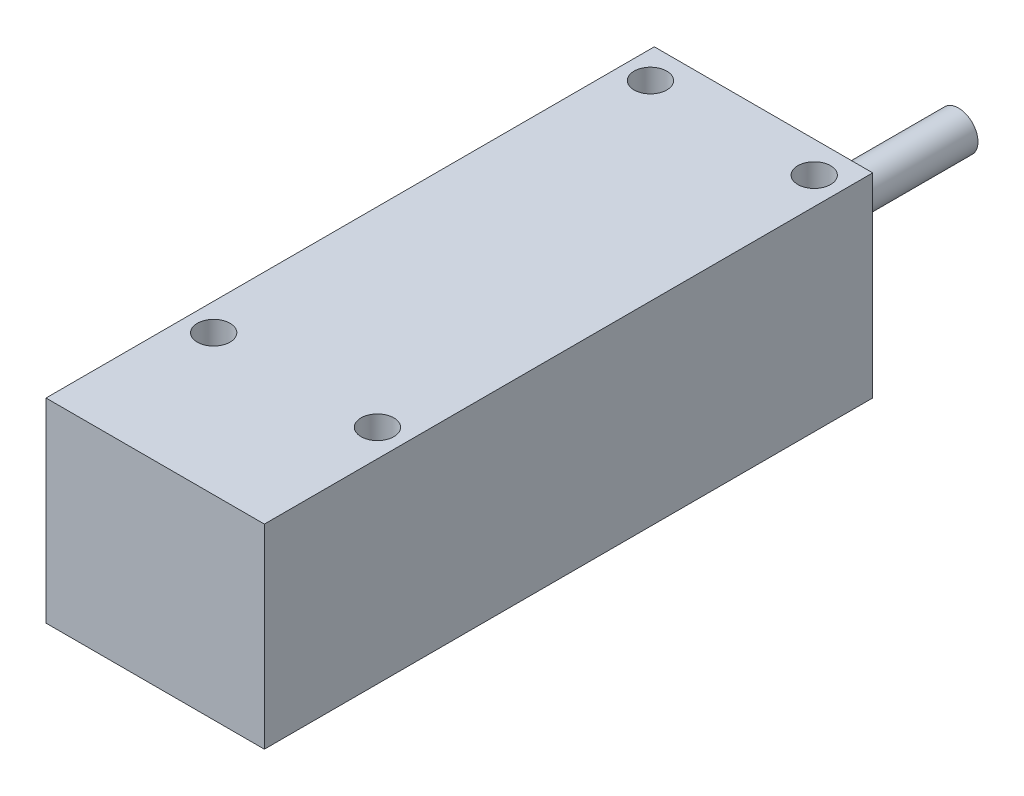
ISO-10303-21;
HEADER;
FILE_DESCRIPTION(('STEP AP214'),'2;1');
FILE_NAME('part.step','',(''),(''),'','','');
FILE_SCHEMA(('AUTOMOTIVE_DESIGN { 1 0 10303 214 1 1 1 1 }'));
ENDSEC;
DATA;
#1=APPLICATION_CONTEXT('core data for automotive mechanical design processes');
#2=APPLICATION_PROTOCOL_DEFINITION('international standard','automotive_design',2000,#1);
#3=PRODUCT_CONTEXT('',#1,'mechanical');
#4=PRODUCT('Part','Part','',(#3));
#5=PRODUCT_RELATED_PRODUCT_CATEGORY('part','',(#4));
#6=PRODUCT_DEFINITION_FORMATION('','',#4);
#7=PRODUCT_DEFINITION_CONTEXT('part definition',#1,'design');
#8=PRODUCT_DEFINITION('design','',#6,#7);
#9=PRODUCT_DEFINITION_SHAPE('','',#8);
#10=(LENGTH_UNIT() NAMED_UNIT(*) SI_UNIT(.MILLI.,.METRE.));
#11=(NAMED_UNIT(*) PLANE_ANGLE_UNIT() SI_UNIT($,.RADIAN.));
#12=(NAMED_UNIT(*) SI_UNIT($,.STERADIAN.) SOLID_ANGLE_UNIT());
#13=UNCERTAINTY_MEASURE_WITH_UNIT(LENGTH_MEASURE(1.E-05),#10,'distance_accuracy_value','');
#14=(GEOMETRIC_REPRESENTATION_CONTEXT(3) GLOBAL_UNCERTAINTY_ASSIGNED_CONTEXT((#13)) GLOBAL_UNIT_ASSIGNED_CONTEXT((#10,
#11,#12)) REPRESENTATION_CONTEXT('',''));
#15=CARTESIAN_POINT('',(0.,0.,0.));
#16=DIRECTION('',(0.,0.,1.));
#17=DIRECTION('',(1.,0.,0.));
#18=AXIS2_PLACEMENT_3D('',#15,#16,#17);
#19=CARTESIAN_POINT('',(-14.,-12.5,39.));
#20=DIRECTION('',(1.,0.,0.));
#21=DIRECTION('',(0.,0.,-1.));
#22=AXIS2_PLACEMENT_3D('',#19,#20,#21);
#23=PLANE('',#22);
#24=DIRECTION('',(0.,-1.,0.));
#25=VECTOR('',#24,1.);
#26=CARTESIAN_POINT('',(-14.,-12.5,-39.));
#27=LINE('',#26,#25);
#28=CARTESIAN_POINT('',(-14.,12.5,-39.));
#29=VERTEX_POINT('',#28);
#30=CARTESIAN_POINT('',(-14.,-12.5,-39.));
#31=VERTEX_POINT('',#30);
#32=EDGE_CURVE('E98',#29,#31,#27,.T.);
#33=ORIENTED_EDGE('',*,*,#32,.T.);
#34=DIRECTION('',(0.,0.,-1.));
#35=VECTOR('',#34,1.);
#36=CARTESIAN_POINT('',(-14.,-12.5,39.));
#37=LINE('',#36,#35);
#38=CARTESIAN_POINT('',(-14.,-12.5,39.));
#39=VERTEX_POINT('',#38);
#40=EDGE_CURVE('E40',#39,#31,#37,.T.);
#41=ORIENTED_EDGE('',*,*,#40,.F.);
#42=DIRECTION('',(0.,-1.,0.));
#43=VECTOR('',#42,1.);
#44=CARTESIAN_POINT('',(-14.,-12.5,39.));
#45=LINE('',#44,#43);
#46=CARTESIAN_POINT('',(-14.,12.5,39.));
#47=VERTEX_POINT('',#46);
#48=EDGE_CURVE('E84',#47,#39,#45,.T.);
#49=ORIENTED_EDGE('',*,*,#48,.F.);
#50=DIRECTION('',(0.,0.,-1.));
#51=VECTOR('',#50,1.);
#52=CARTESIAN_POINT('',(-14.,12.5,39.));
#53=LINE('',#52,#51);
#54=EDGE_CURVE('E94',#47,#29,#53,.T.);
#55=ORIENTED_EDGE('',*,*,#54,.T.);
#56=EDGE_LOOP('',(#33,#41,#49,#55));
#57=FACE_BOUND('',#56,.T.);
#58=ADVANCED_FACE('F32',(#57),#23,.F.);
#59=CARTESIAN_POINT('',(14.,-12.5,39.));
#60=DIRECTION('',(0.,1.,0.));
#61=DIRECTION('',(-1.,0.,0.));
#62=AXIS2_PLACEMENT_3D('',#59,#60,#61);
#63=PLANE('',#62);
#64=CARTESIAN_POINT('',(-10.5,-12.5,-35.));
#65=DIRECTION('',(0.,-1.,0.));
#66=DIRECTION('',(1.,0.,0.));
#67=AXIS2_PLACEMENT_3D('',#64,#65,#66);
#68=CIRCLE('',#67,2.1);
#69=CARTESIAN_POINT('',(-8.40000000000001,-12.5,-35.));
#70=VERTEX_POINT('',#69);
#71=EDGE_CURVE('E157',#70,#70,#68,.T.);
#72=ORIENTED_EDGE('',*,*,#71,.F.);
#73=EDGE_LOOP('',(#72));
#74=FACE_BOUND('',#73,.T.);
#75=CARTESIAN_POINT('',(-10.5,-12.5,21.));
#76=DIRECTION('',(0.,-1.,0.));
#77=DIRECTION('',(1.,0.,0.));
#78=AXIS2_PLACEMENT_3D('',#75,#76,#77);
#79=CIRCLE('',#78,2.1);
#80=CARTESIAN_POINT('',(-8.4,-12.5,21.));
#81=VERTEX_POINT('',#80);
#82=EDGE_CURVE('E168',#81,#81,#79,.T.);
#83=ORIENTED_EDGE('',*,*,#82,.F.);
#84=EDGE_LOOP('',(#83));
#85=FACE_BOUND('',#84,.T.);
#86=CARTESIAN_POINT('',(10.5,-12.5,-35.));
#87=DIRECTION('',(0.,1.,0.));
#88=DIRECTION('',(-1.,0.,0.));
#89=AXIS2_PLACEMENT_3D('',#86,#87,#88);
#90=CIRCLE('',#89,2.1);
#91=CARTESIAN_POINT('',(8.40000000000001,-12.5,-35.));
#92=VERTEX_POINT('',#91);
#93=EDGE_CURVE('E101',#92,#92,#90,.T.);
#94=ORIENTED_EDGE('',*,*,#93,.T.);
#95=EDGE_LOOP('',(#94));
#96=FACE_BOUND('',#95,.T.);
#97=CARTESIAN_POINT('',(10.5,-12.5,21.));
#98=DIRECTION('',(0.,1.,0.));
#99=DIRECTION('',(-1.,0.,0.));
#100=AXIS2_PLACEMENT_3D('',#97,#98,#99);
#101=CIRCLE('',#100,2.1);
#102=CARTESIAN_POINT('',(8.4,-12.5,21.));
#103=VERTEX_POINT('',#102);
#104=EDGE_CURVE('E156',#103,#103,#101,.T.);
#105=ORIENTED_EDGE('',*,*,#104,.T.);
#106=EDGE_LOOP('',(#105));
#107=FACE_BOUND('',#106,.T.);
#108=DIRECTION('',(1.,0.,0.));
#109=VECTOR('',#108,1.);
#110=CARTESIAN_POINT('',(14.,-12.5,-39.));
#111=LINE('',#110,#109);
#112=CARTESIAN_POINT('',(14.,-12.5,-39.));
#113=VERTEX_POINT('',#112);
#114=EDGE_CURVE('E89',#31,#113,#111,.T.);
#115=ORIENTED_EDGE('',*,*,#114,.T.);
#116=DIRECTION('',(0.,0.,-1.));
#117=VECTOR('',#116,1.);
#118=CARTESIAN_POINT('',(14.,-12.5,39.));
#119=LINE('',#118,#117);
#120=CARTESIAN_POINT('',(14.,-12.5,39.));
#121=VERTEX_POINT('',#120);
#122=EDGE_CURVE('E87',#121,#113,#119,.T.);
#123=ORIENTED_EDGE('',*,*,#122,.F.);
#124=DIRECTION('',(1.,0.,0.));
#125=VECTOR('',#124,1.);
#126=CARTESIAN_POINT('',(14.,-12.5,39.));
#127=LINE('',#126,#125);
#128=EDGE_CURVE('E79',#39,#121,#127,.T.);
#129=ORIENTED_EDGE('',*,*,#128,.F.);
#130=ORIENTED_EDGE('',*,*,#40,.T.);
#131=EDGE_LOOP('',(#115,#123,#129,#130));
#132=FACE_BOUND('',#131,.T.);
#133=ADVANCED_FACE('F88',(#74,#85,#96,#107,#132),#63,.F.);
#134=CARTESIAN_POINT('',(14.,-12.5,39.));
#135=DIRECTION('',(-1.,0.,0.));
#136=DIRECTION('',(0.,0.,1.));
#137=AXIS2_PLACEMENT_3D('',#134,#135,#136);
#138=PLANE('',#137);
#139=DIRECTION('',(0.,1.,0.));
#140=VECTOR('',#139,1.);
#141=CARTESIAN_POINT('',(14.,-12.5,-39.));
#142=LINE('',#141,#140);
#143=CARTESIAN_POINT('',(14.,12.5,-39.));
#144=VERTEX_POINT('',#143);
#145=EDGE_CURVE('E65',#113,#144,#142,.T.);
#146=ORIENTED_EDGE('',*,*,#145,.T.);
#147=DIRECTION('',(0.,0.,-1.));
#148=VECTOR('',#147,1.);
#149=CARTESIAN_POINT('',(14.,12.5,39.));
#150=LINE('',#149,#148);
#151=CARTESIAN_POINT('',(14.,12.5,39.));
#152=VERTEX_POINT('',#151);
#153=EDGE_CURVE('E90',#152,#144,#150,.T.);
#154=ORIENTED_EDGE('',*,*,#153,.F.);
#155=DIRECTION('',(0.,1.,0.));
#156=VECTOR('',#155,1.);
#157=CARTESIAN_POINT('',(14.,-12.5,39.));
#158=LINE('',#157,#156);
#159=EDGE_CURVE('E82',#121,#152,#158,.T.);
#160=ORIENTED_EDGE('',*,*,#159,.F.);
#161=ORIENTED_EDGE('',*,*,#122,.T.);
#162=EDGE_LOOP('',(#146,#154,#160,#161));
#163=FACE_BOUND('',#162,.T.);
#164=ADVANCED_FACE('F92',(#163),#138,.F.);
#165=CARTESIAN_POINT('',(14.,12.5,39.));
#166=DIRECTION('',(0.,-1.,0.));
#167=DIRECTION('',(1.,0.,0.));
#168=AXIS2_PLACEMENT_3D('',#165,#166,#167);
#169=PLANE('',#168);
#170=CARTESIAN_POINT('',(-10.5,12.5,-35.));
#171=DIRECTION('',(0.,-1.,0.));
#172=DIRECTION('',(1.,0.,0.));
#173=AXIS2_PLACEMENT_3D('',#170,#171,#172);
#174=CIRCLE('',#173,2.1);
#175=CARTESIAN_POINT('',(-8.4,12.5,-35.));
#176=VERTEX_POINT('',#175);
#177=EDGE_CURVE('E143',#176,#176,#174,.T.);
#178=ORIENTED_EDGE('',*,*,#177,.T.);
#179=EDGE_LOOP('',(#178));
#180=FACE_BOUND('',#179,.T.);
#181=CARTESIAN_POINT('',(-10.5,12.5,21.));
#182=DIRECTION('',(0.,-1.,0.));
#183=DIRECTION('',(1.,0.,0.));
#184=AXIS2_PLACEMENT_3D('',#181,#182,#183);
#185=CIRCLE('',#184,2.1);
#186=CARTESIAN_POINT('',(-8.4,12.5,21.));
#187=VERTEX_POINT('',#186);
#188=EDGE_CURVE('E147',#187,#187,#185,.T.);
#189=ORIENTED_EDGE('',*,*,#188,.T.);
#190=EDGE_LOOP('',(#189));
#191=FACE_BOUND('',#190,.T.);
#192=CARTESIAN_POINT('',(10.5,12.5,-35.));
#193=DIRECTION('',(0.,1.,0.));
#194=DIRECTION('',(-1.,0.,0.));
#195=AXIS2_PLACEMENT_3D('',#192,#193,#194);
#196=CIRCLE('',#195,2.1);
#197=CARTESIAN_POINT('',(8.4,12.5,-35.));
#198=VERTEX_POINT('',#197);
#199=EDGE_CURVE('E151',#198,#198,#196,.T.);
#200=ORIENTED_EDGE('',*,*,#199,.F.);
#201=EDGE_LOOP('',(#200));
#202=FACE_BOUND('',#201,.T.);
#203=CARTESIAN_POINT('',(10.5,12.5,21.));
#204=DIRECTION('',(0.,1.,0.));
#205=DIRECTION('',(-1.,0.,0.));
#206=AXIS2_PLACEMENT_3D('',#203,#204,#205);
#207=CIRCLE('',#206,2.1);
#208=CARTESIAN_POINT('',(8.4,12.5,21.));
#209=VERTEX_POINT('',#208);
#210=EDGE_CURVE('E154',#209,#209,#207,.T.);
#211=ORIENTED_EDGE('',*,*,#210,.F.);
#212=EDGE_LOOP('',(#211));
#213=FACE_BOUND('',#212,.T.);
#214=DIRECTION('',(-1.,0.,0.));
#215=VECTOR('',#214,1.);
#216=CARTESIAN_POINT('',(14.,12.5,-39.));
#217=LINE('',#216,#215);
#218=EDGE_CURVE('E71',#144,#29,#217,.T.);
#219=ORIENTED_EDGE('',*,*,#218,.T.);
#220=ORIENTED_EDGE('',*,*,#54,.F.);
#221=DIRECTION('',(-1.,0.,0.));
#222=VECTOR('',#221,1.);
#223=CARTESIAN_POINT('',(14.,12.5,39.));
#224=LINE('',#223,#222);
#225=EDGE_CURVE('E48',#152,#47,#224,.T.);
#226=ORIENTED_EDGE('',*,*,#225,.F.);
#227=ORIENTED_EDGE('',*,*,#153,.T.);
#228=EDGE_LOOP('',(#219,#220,#226,#227));
#229=FACE_BOUND('',#228,.T.);
#230=ADVANCED_FACE('F121',(#180,#191,#202,#213,#229),#169,.F.);
#231=CARTESIAN_POINT('',(0.,0.,39.));
#232=DIRECTION('',(0.,0.,1.));
#233=DIRECTION('',(1.,0.,0.));
#234=AXIS2_PLACEMENT_3D('',#231,#232,#233);
#235=PLANE('',#234);
#236=ORIENTED_EDGE('',*,*,#48,.T.);
#237=ORIENTED_EDGE('',*,*,#128,.T.);
#238=ORIENTED_EDGE('',*,*,#159,.T.);
#239=ORIENTED_EDGE('',*,*,#225,.T.);
#240=EDGE_LOOP('',(#236,#237,#238,#239));
#241=FACE_BOUND('',#240,.T.);
#242=ADVANCED_FACE('F80',(#241),#235,.T.);
#243=CARTESIAN_POINT('',(0.,0.,-39.));
#244=DIRECTION('',(0.,0.,1.));
#245=DIRECTION('',(1.,0.,0.));
#246=AXIS2_PLACEMENT_3D('',#243,#244,#245);
#247=PLANE('',#246);
#248=CARTESIAN_POINT('',(0.,-2.3,-39.));
#249=DIRECTION('',(0.,0.,1.));
#250=DIRECTION('',(1.,0.,0.));
#251=AXIS2_PLACEMENT_3D('',#248,#249,#250);
#252=CIRCLE('',#251,2.5);
#253=CARTESIAN_POINT('',(2.5,-2.3,-39.));
#254=VERTEX_POINT('',#253);
#255=EDGE_CURVE('E11',#254,#254,#252,.F.);
#256=ORIENTED_EDGE('',*,*,#255,.F.);
#257=EDGE_LOOP('',(#256));
#258=FACE_BOUND('',#257,.T.);
#259=ORIENTED_EDGE('',*,*,#32,.F.);
#260=ORIENTED_EDGE('',*,*,#218,.F.);
#261=ORIENTED_EDGE('',*,*,#145,.F.);
#262=ORIENTED_EDGE('',*,*,#114,.F.);
#263=EDGE_LOOP('',(#259,#260,#261,#262));
#264=FACE_BOUND('',#263,.T.);
#265=ADVANCED_FACE('F109',(#258,#264),#247,.F.);
#266=CARTESIAN_POINT('',(10.5,-12.5,21.));
#267=DIRECTION('',(0.,1.,0.));
#268=DIRECTION('',(-1.,0.,0.));
#269=AXIS2_PLACEMENT_3D('',#266,#267,#268);
#270=CYLINDRICAL_SURFACE('',#269,2.1);
#271=ORIENTED_EDGE('',*,*,#104,.F.);
#272=EDGE_LOOP('',(#271));
#273=FACE_BOUND('',#272,.T.);
#274=ORIENTED_EDGE('',*,*,#210,.T.);
#275=EDGE_LOOP('',(#274));
#276=FACE_BOUND('',#275,.T.);
#277=ADVANCED_FACE('F111',(#273,#276),#270,.F.);
#278=CARTESIAN_POINT('',(10.5,-12.5,-35.));
#279=DIRECTION('',(0.,1.,0.));
#280=DIRECTION('',(-1.,0.,0.));
#281=AXIS2_PLACEMENT_3D('',#278,#279,#280);
#282=CYLINDRICAL_SURFACE('',#281,2.1);
#283=ORIENTED_EDGE('',*,*,#93,.F.);
#284=EDGE_LOOP('',(#283));
#285=FACE_BOUND('',#284,.T.);
#286=ORIENTED_EDGE('',*,*,#199,.T.);
#287=EDGE_LOOP('',(#286));
#288=FACE_BOUND('',#287,.T.);
#289=ADVANCED_FACE('F118',(#285,#288),#282,.F.);
#290=CARTESIAN_POINT('',(-10.5,-12.5,21.));
#291=DIRECTION('',(0.,1.,0.));
#292=DIRECTION('',(-1.,0.,0.));
#293=AXIS2_PLACEMENT_3D('',#290,#291,#292);
#294=CYLINDRICAL_SURFACE('',#293,2.1);
#295=ORIENTED_EDGE('',*,*,#82,.T.);
#296=EDGE_LOOP('',(#295));
#297=FACE_BOUND('',#296,.T.);
#298=ORIENTED_EDGE('',*,*,#188,.F.);
#299=EDGE_LOOP('',(#298));
#300=FACE_BOUND('',#299,.T.);
#301=ADVANCED_FACE('F188',(#297,#300),#294,.F.);
#302=CARTESIAN_POINT('',(-10.5,-12.5,-35.));
#303=DIRECTION('',(0.,1.,0.));
#304=DIRECTION('',(-1.,0.,0.));
#305=AXIS2_PLACEMENT_3D('',#302,#303,#304);
#306=CYLINDRICAL_SURFACE('',#305,2.1);
#307=ORIENTED_EDGE('',*,*,#71,.T.);
#308=EDGE_LOOP('',(#307));
#309=FACE_BOUND('',#308,.T.);
#310=ORIENTED_EDGE('',*,*,#177,.F.);
#311=EDGE_LOOP('',(#310));
#312=FACE_BOUND('',#311,.T.);
#313=ADVANCED_FACE('F181',(#309,#312),#306,.F.);
#314=CARTESIAN_POINT('',(0.,-2.3,-64.));
#315=DIRECTION('',(0.,0.,1.));
#316=DIRECTION('',(1.,0.,0.));
#317=AXIS2_PLACEMENT_3D('',#314,#315,#316);
#318=CYLINDRICAL_SURFACE('',#317,2.5);
#319=CARTESIAN_POINT('',(0.,-2.3,-64.));
#320=DIRECTION('',(0.,0.,-1.));
#321=DIRECTION('',(-1.,0.,0.));
#322=AXIS2_PLACEMENT_3D('',#319,#320,#321);
#323=CIRCLE('',#322,2.5);
#324=CARTESIAN_POINT('',(-2.5,-2.3,-64.));
#325=VERTEX_POINT('',#324);
#326=EDGE_CURVE('E169',#325,#325,#323,.T.);
#327=ORIENTED_EDGE('',*,*,#326,.F.);
#328=EDGE_LOOP('',(#327));
#329=FACE_BOUND('',#328,.T.);
#330=ORIENTED_EDGE('',*,*,#255,.T.);
#331=EDGE_LOOP('',(#330));
#332=FACE_BOUND('',#331,.T.);
#333=ADVANCED_FACE('F178',(#329,#332),#318,.T.);
#334=CARTESIAN_POINT('',(0.,-2.3,-64.));
#335=DIRECTION('',(0.,0.,-1.));
#336=DIRECTION('',(-1.,0.,0.));
#337=AXIS2_PLACEMENT_3D('',#334,#335,#336);
#338=PLANE('',#337);
#339=ORIENTED_EDGE('',*,*,#326,.T.);
#340=EDGE_LOOP('',(#339));
#341=FACE_BOUND('',#340,.T.);
#342=ADVANCED_FACE('F176',(#341),#338,.T.);
#343=CLOSED_SHELL('',(#58,#133,#164,#230,#242,#265,#277,#289,#301,#313,#333,#342));
#344=MANIFOLD_SOLID_BREP('B2',#343);
#345=ADVANCED_BREP_SHAPE_REPRESENTATION('',(#18,#344),#14);
#346=SHAPE_DEFINITION_REPRESENTATION(#9,#345);
ENDSEC;
END-ISO-10303-21;
